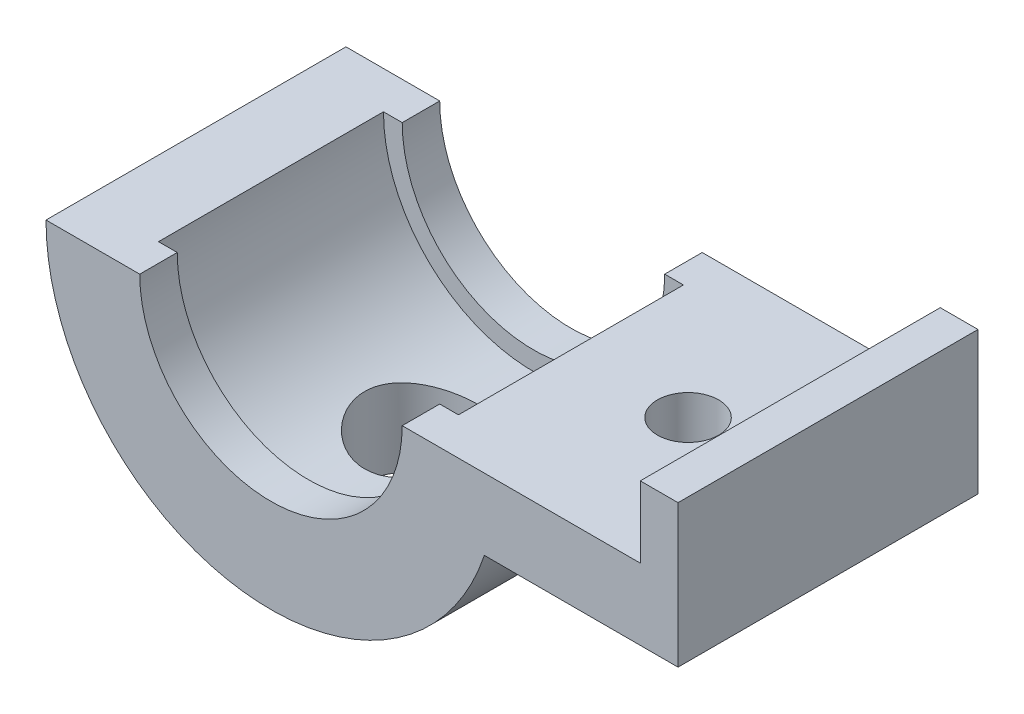
ISO-10303-21;
HEADER;
FILE_DESCRIPTION(('STEP AP214'),'2;1');
FILE_NAME('part.step','',(''),(''),'','','');
FILE_SCHEMA(('AUTOMOTIVE_DESIGN { 1 0 10303 214 1 1 1 1 }'));
ENDSEC;
DATA;
#1=APPLICATION_CONTEXT('core data for automotive mechanical design processes');
#2=APPLICATION_PROTOCOL_DEFINITION('international standard','automotive_design',2000,#1);
#3=PRODUCT_CONTEXT('',#1,'mechanical');
#4=PRODUCT('Part','Part','',(#3));
#5=PRODUCT_RELATED_PRODUCT_CATEGORY('part','',(#4));
#6=PRODUCT_DEFINITION_FORMATION('','',#4);
#7=PRODUCT_DEFINITION_CONTEXT('part definition',#1,'design');
#8=PRODUCT_DEFINITION('design','',#6,#7);
#9=PRODUCT_DEFINITION_SHAPE('','',#8);
#10=(LENGTH_UNIT() NAMED_UNIT(*) SI_UNIT(.MILLI.,.METRE.));
#11=(NAMED_UNIT(*) PLANE_ANGLE_UNIT() SI_UNIT($,.RADIAN.));
#12=(NAMED_UNIT(*) SI_UNIT($,.STERADIAN.) SOLID_ANGLE_UNIT());
#13=UNCERTAINTY_MEASURE_WITH_UNIT(LENGTH_MEASURE(1.E-05),#10,'distance_accuracy_value','');
#14=(GEOMETRIC_REPRESENTATION_CONTEXT(3) GLOBAL_UNCERTAINTY_ASSIGNED_CONTEXT((#13)) GLOBAL_UNIT_ASSIGNED_CONTEXT((#10,
#11,#12)) REPRESENTATION_CONTEXT('',''));
#15=CARTESIAN_POINT('',(0.,0.,0.));
#16=DIRECTION('',(0.,0.,1.));
#17=DIRECTION('',(1.,0.,0.));
#18=AXIS2_PLACEMENT_3D('',#15,#16,#17);
#19=CARTESIAN_POINT('',(35.,0.,-40.));
#20=DIRECTION('',(0.,1.,0.));
#21=DIRECTION('',(0.,0.,1.));
#22=AXIS2_PLACEMENT_3D('',#19,#20,#21);
#23=PLANE('',#22);
#24=CARTESIAN_POINT('',(71.2325551320015,0.,0.));
#25=DIRECTION('',(0.,1.,0.));
#26=DIRECTION('',(0.,0.,1.));
#27=AXIS2_PLACEMENT_3D('',#24,#25,#26);
#28=CIRCLE('',#27,8.1629970329379);
#29=CARTESIAN_POINT('',(71.2325551320015,0.,8.1629970329379));
#30=VERTEX_POINT('',#29);
#31=EDGE_CURVE('E163',#30,#30,#28,.T.);
#32=ORIENTED_EDGE('',*,*,#31,.F.);
#33=EDGE_LOOP('',(#32));
#34=FACE_BOUND('',#33,.T.);
#35=DIRECTION('',(-1.,0.,0.));
#36=VECTOR('',#35,1.);
#37=CARTESIAN_POINT('',(35.,0.,40.));
#38=LINE('',#37,#36);
#39=CARTESIAN_POINT('',(98.4889316436633,0.,40.));
#40=VERTEX_POINT('',#39);
#41=CARTESIAN_POINT('',(35.,0.,40.));
#42=VERTEX_POINT('',#41);
#43=EDGE_CURVE('E62',#40,#42,#38,.T.);
#44=ORIENTED_EDGE('',*,*,#43,.F.);
#45=DIRECTION('',(0.,0.,1.));
#46=VECTOR('',#45,1.);
#47=CARTESIAN_POINT('',(98.4889316436633,0.,-40.));
#48=LINE('',#47,#46);
#49=CARTESIAN_POINT('',(98.4889316436633,0.,-40.));
#50=VERTEX_POINT('',#49);
#51=EDGE_CURVE('E57',#50,#40,#48,.T.);
#52=ORIENTED_EDGE('',*,*,#51,.F.);
#53=DIRECTION('',(-1.,0.,0.));
#54=VECTOR('',#53,1.);
#55=CARTESIAN_POINT('',(35.,0.,-40.));
#56=LINE('',#55,#54);
#57=CARTESIAN_POINT('',(35.,0.,-40.));
#58=VERTEX_POINT('',#57);
#59=EDGE_CURVE('E401',#50,#58,#56,.T.);
#60=ORIENTED_EDGE('',*,*,#59,.T.);
#61=DIRECTION('',(0.,0.,1.));
#62=VECTOR('',#61,1.);
#63=CARTESIAN_POINT('',(35.,0.,-40.));
#64=LINE('',#63,#62);
#65=CARTESIAN_POINT('',(35.,0.,-30.));
#66=VERTEX_POINT('',#65);
#67=EDGE_CURVE('E406',#58,#66,#64,.T.);
#68=ORIENTED_EDGE('',*,*,#67,.T.);
#69=DIRECTION('',(1.,0.,0.));
#70=VECTOR('',#69,1.);
#71=CARTESIAN_POINT('',(35.,0.,-30.));
#72=LINE('',#71,#70);
#73=CARTESIAN_POINT('',(40.,0.,-30.));
#74=VERTEX_POINT('',#73);
#75=EDGE_CURVE('E424',#66,#74,#72,.T.);
#76=ORIENTED_EDGE('',*,*,#75,.T.);
#77=DIRECTION('',(0.,0.,-1.));
#78=VECTOR('',#77,1.);
#79=CARTESIAN_POINT('',(40.,0.,30.));
#80=LINE('',#79,#78);
#81=CARTESIAN_POINT('',(40.,0.,30.));
#82=VERTEX_POINT('',#81);
#83=EDGE_CURVE('E435',#74,#82,#80,.F.);
#84=ORIENTED_EDGE('',*,*,#83,.T.);
#85=DIRECTION('',(1.,0.,0.));
#86=VECTOR('',#85,1.);
#87=CARTESIAN_POINT('',(35.,0.,30.));
#88=LINE('',#87,#86);
#89=CARTESIAN_POINT('',(35.,0.,30.));
#90=VERTEX_POINT('',#89);
#91=EDGE_CURVE('E420',#90,#82,#88,.T.);
#92=ORIENTED_EDGE('',*,*,#91,.F.);
#93=EDGE_CURVE('E399',#90,#42,#64,.T.);
#94=ORIENTED_EDGE('',*,*,#93,.T.);
#95=EDGE_LOOP('',(#44,#52,#60,#68,#76,#84,#92,#94));
#96=FACE_BOUND('',#95,.T.);
#97=ADVANCED_FACE('F39',(#34,#96),#23,.T.);
#98=CARTESIAN_POINT('',(0.,0.,-40.));
#99=DIRECTION('',(0.,0.,1.));
#100=DIRECTION('',(1.,0.,0.));
#101=AXIS2_PLACEMENT_3D('',#98,#99,#100);
#102=CYLINDRICAL_SURFACE('',#101,60.);
#103=CARTESIAN_POINT('',(0.,-60.,15.));
#104=CARTESIAN_POINT('',(-0.414415031152329,-59.9999990212772,14.9999982513786));
#105=CARTESIAN_POINT('',(-0.828865177127538,-59.9956958137385,14.9828115256312));
#106=CARTESIAN_POINT('',(-1.65477222486746,-59.9785995385129,14.9142041325291));
#107=CARTESIAN_POINT('',(-2.06622877970378,-59.9658055021792,14.8627795592657));
#108=CARTESIAN_POINT('',(-2.88336026305808,-59.9320742475583,14.7260961940826));
#109=CARTESIAN_POINT('',(-3.28903215036171,-59.9111328985038,14.6408202387339));
#110=CARTESIAN_POINT('',(-4.09148350940317,-59.8616853391716,14.4371437304935));
#111=CARTESIAN_POINT('',(-4.48826320816741,-59.8331793222664,14.318744024327));
#112=CARTESIAN_POINT('',(-5.26971792546056,-59.7694201661329,14.0499324418028));
#113=CARTESIAN_POINT('',(-5.65440707152432,-59.7341752704624,13.8995596526577));
#114=CARTESIAN_POINT('',(-6.40960090891932,-59.6578668070925,13.5678703590465));
#115=CARTESIAN_POINT('',(-6.78010552512076,-59.6168032085792,13.3865536907107));
#116=CARTESIAN_POINT('',(-7.50450174776048,-59.5299550145894,12.99431049265));
#117=CARTESIAN_POINT('',(-7.85839359463823,-59.4841704874704,12.7833843916439));
#118=CARTESIAN_POINT('',(-8.54732477282215,-59.389091455063,12.3333909755978));
#119=CARTESIAN_POINT('',(-8.88236327250113,-59.3397967951584,12.0943224206211));
#120=CARTESIAN_POINT('',(-9.53747021532843,-59.2380669554889,11.584989053153));
#121=CARTESIAN_POINT('',(-9.85714762091099,-59.185590574916,11.3142294012828));
#122=CARTESIAN_POINT('',(-10.4726747741415,-59.0797818778322,10.7470108491145));
#123=CARTESIAN_POINT('',(-10.7685242401378,-59.0264495512127,10.4505516451279));
#124=CARTESIAN_POINT('',(-11.3344931170602,-58.9203885746364,9.83384195462124));
#125=CARTESIAN_POINT('',(-11.6046093369326,-58.8676600002593,9.51358852623765));
#126=CARTESIAN_POINT('',(-12.1172537986861,-58.7642795799148,8.85141104836226));
#127=CARTESIAN_POINT('',(-12.3597827535991,-58.7136276802944,8.50948755931975));
#128=CARTESIAN_POINT('',(-12.8189816118067,-58.6150978639965,7.80093437937954));
#129=CARTESIAN_POINT('',(-13.0352120253514,-58.5672725696924,7.43401232473522));
#130=CARTESIAN_POINT('',(-13.4359199038929,-58.4766472825933,6.68261526065164));
#131=CARTESIAN_POINT('',(-13.6203969680463,-58.433847353239,6.29814002970463));
#132=CARTESIAN_POINT('',(-13.9561270829236,-58.3545738248081,5.5143669552817));
#133=CARTESIAN_POINT('',(-14.1073842665445,-58.3180994388874,5.11507096289577));
#134=CARTESIAN_POINT('',(-14.3754523010491,-58.2526002290377,4.30448428479723));
#135=CARTESIAN_POINT('',(-14.4922639770391,-58.2235752266686,3.8931938866575));
#136=CARTESIAN_POINT('',(-14.6884504119626,-58.1743882934223,3.06999366538015));
#137=CARTESIAN_POINT('',(-14.7685281338398,-58.1540604879679,2.65826124189149));
#138=CARTESIAN_POINT('',(-14.8939506116738,-58.1220649835953,1.82920515599655));
#139=CARTESIAN_POINT('',(-14.9392957887028,-58.1103971796894,1.41188156143601));
#140=CARTESIAN_POINT('',(-14.9948497395526,-58.0960868540863,0.574807014125323));
#141=CARTESIAN_POINT('',(-15.0050635020682,-58.0934430509726,0.155056414492343));
#142=CARTESIAN_POINT('',(-14.9902770061642,-58.0972603112452,-0.683779210823856));
#143=CARTESIAN_POINT('',(-14.9652772373859,-58.1037212480307,-1.10286424568058));
#144=CARTESIAN_POINT('',(-14.8813213611209,-58.1252792391452,-1.92709534972119));
#145=CARTESIAN_POINT('',(-14.8232043401012,-58.1401628280118,-2.33233281893186));
#146=CARTESIAN_POINT('',(-14.6741460581697,-58.1779626704993,-3.1363342473404));
#147=CARTESIAN_POINT('',(-14.5832054078995,-58.2008787746853,-3.53509832682316));
#148=CARTESIAN_POINT('',(-14.3692298841906,-58.2540759960574,-4.32343147577072));
#149=CARTESIAN_POINT('',(-14.246193444193,-58.284357472734,-4.71300009540322));
#150=CARTESIAN_POINT('',(-13.968984149895,-58.3514164276321,-5.48031895848233));
#151=CARTESIAN_POINT('',(-13.814810805212,-58.3881940081611,-5.85806901568728));
#152=CARTESIAN_POINT('',(-13.4747678044654,-58.4676098785467,-6.60302709105003));
#153=CARTESIAN_POINT('',(-13.2885944462794,-58.5103034839325,-6.9700905472671));
#154=CARTESIAN_POINT('',(-12.8869942084194,-58.6000656495573,-7.68728161079928));
#155=CARTESIAN_POINT('',(-12.6715672207223,-58.6471342259512,-8.0374091555697));
#156=CARTESIAN_POINT('',(-12.2129089816034,-58.7443596923192,-8.71857019928794));
#157=CARTESIAN_POINT('',(-11.9696736689771,-58.7945170328901,-9.04960089863109));
#158=CARTESIAN_POINT('',(-11.457029276384,-58.8965598978932,-9.69045217253495));
#159=CARTESIAN_POINT('',(-11.187619690236,-58.9484454557344,-10.0002723367101));
#160=CARTESIAN_POINT('',(-10.6163053259096,-59.05404993838,-10.6052849357017));
#161=CARTESIAN_POINT('',(-10.3136925474027,-59.1077789230623,-10.8998074798551));
#162=CARTESIAN_POINT('',(-9.68460506109727,-59.2141044830185,-11.4623948437548));
#163=CARTESIAN_POINT('',(-9.35812988726896,-59.26670103615,-11.7304591465342));
#164=CARTESIAN_POINT('',(-8.68345927450772,-59.3693013435736,-12.238292604832));
#165=CARTESIAN_POINT('',(-8.33526298615102,-59.4193049963276,-12.4780606527381));
#166=CARTESIAN_POINT('',(-7.6194773312438,-59.5153252061723,-12.9275737893408));
#167=CARTESIAN_POINT('',(-7.25188808297449,-59.5613417875761,-13.1373190611228));
#168=CARTESIAN_POINT('',(-6.49849482068106,-59.6482508279205,-13.5258947757965));
#169=CARTESIAN_POINT('',(-6.11263206168022,-59.6891249639438,-13.7046154892899));
#170=CARTESIAN_POINT('',(-5.32657430647362,-59.764399712673,-14.0288400773493));
#171=CARTESIAN_POINT('',(-4.92637922976253,-59.7988002890097,-14.1743437652996));
#172=CARTESIAN_POINT('',(-4.11460263537916,-59.8601343840093,-14.4309118169275));
#173=CARTESIAN_POINT('',(-3.70302290075579,-59.8870690647689,-14.5419815407098));
#174=CARTESIAN_POINT('',(-2.87146870312269,-59.9326958329816,-14.7287557262455));
#175=CARTESIAN_POINT('',(-2.45149444734257,-59.9513881236467,-14.8044610598931));
#176=CARTESIAN_POINT('',(-1.61715710849188,-59.9796178381032,-14.9183617088027));
#177=CARTESIAN_POINT('',(-1.20292567409389,-59.989377407444,-14.9574677940361));
#178=CARTESIAN_POINT('',(-0.372535473351761,-60.0002801559201,-15.0011356809785));
#179=CARTESIAN_POINT('',(0.0436232599910904,-60.0014234820501,-15.0056980720094));
#180=CARTESIAN_POINT('',(0.874778652969329,-59.9950620411867,-14.9802409315793));
#181=CARTESIAN_POINT('',(1.28977540609494,-59.9875579912256,-14.9502242673816));
#182=CARTESIAN_POINT('',(2.115605360557,-59.9641130343762,-14.8558721196687));
#183=CARTESIAN_POINT('',(2.52643857816607,-59.9481721604751,-14.7915367703362));
#184=CARTESIAN_POINT('',(3.33491700211606,-59.9085946352651,-14.6303011829582));
#185=CARTESIAN_POINT('',(3.73266745700123,-59.8850758192925,-14.5338988800892));
#186=CARTESIAN_POINT('',(4.51851147499013,-59.8309132808785,-14.3090906707923));
#187=CARTESIAN_POINT('',(4.90660516270469,-59.8002696504284,-14.1806851775692));
#188=CARTESIAN_POINT('',(5.67056994821774,-59.7326687672958,-13.8928498096287));
#189=CARTESIAN_POINT('',(6.04644014282222,-59.6957110493213,-13.733417648402));
#190=CARTESIAN_POINT('',(6.78348695008258,-59.6164550142952,-13.3847122795827));
#191=CARTESIAN_POINT('',(7.14466329131014,-59.5741565986481,-13.1954385210636));
#192=CARTESIAN_POINT('',(7.85628879766163,-59.4845326121402,-12.7847748833131));
#193=CARTESIAN_POINT('',(8.20643404326051,-59.4371311779976,-12.5628748791056));
#194=CARTESIAN_POINT('',(8.88687850660034,-59.3392076529078,-12.0911038276452));
#195=CARTESIAN_POINT('',(9.21717753166791,-59.2886855316736,-11.8412325089053));
#196=CARTESIAN_POINT('',(9.8558812728268,-59.1858620637829,-11.3151581391403));
#197=CARTESIAN_POINT('',(10.1642826522026,-59.1335604477592,-11.038951090093));
#198=CARTESIAN_POINT('',(10.7571797495061,-59.0285841290434,-10.4620351890063));
#199=CARTESIAN_POINT('',(11.0416751968834,-58.9759094221362,-10.1613260597457));
#200=CARTESIAN_POINT('',(11.5916120324103,-58.8703224072042,-9.52964680036491));
#201=CARTESIAN_POINT('',(11.856413160808,-58.8174360855768,-9.19811452423791));
#202=CARTESIAN_POINT('',(12.3571634560666,-58.7142732843699,-8.5135400404505));
#203=CARTESIAN_POINT('',(12.5931120964092,-58.6639968524269,-8.1604974404322));
#204=CARTESIAN_POINT('',(13.0344485947135,-58.5675182509941,-7.43527548124412));
#205=CARTESIAN_POINT('',(13.2398371684664,-58.5213159860877,-7.06309657056827));
#206=CARTESIAN_POINT('',(13.6185056268275,-58.4343569087878,-6.30213527518355));
#207=CARTESIAN_POINT('',(13.7917859581176,-58.3936000206418,-5.91335312154752));
#208=CARTESIAN_POINT('',(14.1039245928626,-58.3189928454895,-5.12427975033881));
#209=CARTESIAN_POINT('',(14.2429831869188,-58.2851025868138,-4.72407158157005));
#210=CARTESIAN_POINT('',(14.486872684975,-58.2249629937438,-3.91279020846945));
#211=CARTESIAN_POINT('',(14.5917036369446,-58.1987136486409,-3.50171701936568));
#212=CARTESIAN_POINT('',(14.7662190899979,-58.1546806858336,-2.67180492240674));
#213=CARTESIAN_POINT('',(14.8359100402463,-58.1368955147523,-2.25296745415154));
#214=CARTESIAN_POINT('',(14.9395526451384,-58.1103488477808,-1.41061301743722));
#215=CARTESIAN_POINT('',(14.9735051596328,-58.1015871347904,-0.987096161809816));
#216=CARTESIAN_POINT('',(15.0049083306892,-58.0934847297816,-0.15082867616439));
#217=CARTESIAN_POINT('',(15.0033804310492,-58.0938804050574,0.261881388519998));
#218=CARTESIAN_POINT('',(14.9663395836518,-58.1034340314097,1.08566536046238));
#219=CARTESIAN_POINT('',(14.9308273235709,-58.1125918051844,1.49673930065848));
#220=CARTESIAN_POINT('',(14.8261237251337,-58.1393925403981,2.31427949814698));
#221=CARTESIAN_POINT('',(14.7569332823055,-58.1570352762153,2.72074587766381));
#222=CARTESIAN_POINT('',(14.5854532644127,-58.200277995233,3.52620151630435));
#223=CARTESIAN_POINT('',(14.4831635234226,-58.2258780183229,3.92519073793478));
#224=CARTESIAN_POINT('',(14.2470250698785,-58.2841055202704,4.71056454910861));
#225=CARTESIAN_POINT('',(14.1133689913662,-58.3166900027724,5.0970103068742));
#226=CARTESIAN_POINT('',(13.8152021764003,-58.3880438880629,5.857208630456));
#227=CARTESIAN_POINT('',(13.6506916610057,-58.4268132465389,6.2309612871903));
#228=CARTESIAN_POINT('',(13.2920021544663,-58.5094567895869,6.96340303885025));
#229=CARTESIAN_POINT('',(13.0978200005075,-58.5533315182408,7.32209052271876));
#230=CARTESIAN_POINT('',(12.6811544509806,-58.6449810815152,8.02210956167509));
#231=CARTESIAN_POINT('',(12.458670452026,-58.6927559992788,8.36344074651485));
#232=CARTESIAN_POINT('',(11.9807255554322,-58.7922045754333,9.03529585402747));
#233=CARTESIAN_POINT('',(11.7245556260798,-58.8439474391643,9.3653053323191));
#234=CARTESIAN_POINT('',(11.185709798109,-58.9487507139632,10.0027027788286));
#235=CARTESIAN_POINT('',(10.9030334264329,-59.0018111485332,10.3100903431408));
#236=CARTESIAN_POINT('',(10.3129641159302,-59.1078050911363,10.9003186177996));
#237=CARTESIAN_POINT('',(10.0055655042192,-59.1607385671509,11.183153663069));
#238=CARTESIAN_POINT('',(9.36809923917265,-59.2650234713998,11.7223285281152));
#239=CARTESIAN_POINT('',(9.03803160357736,-59.3163749008722,11.9786683686262));
#240=CARTESIAN_POINT('',(8.35117725650719,-59.4170047912239,12.4675066358601));
#241=CARTESIAN_POINT('',(7.9940145122165,-59.4662287612614,12.6994883165733));
#242=CARTESIAN_POINT('',(7.2607958151773,-59.5602000765112,13.1324833827577));
#243=CARTESIAN_POINT('',(6.88473897414382,-59.6049472109536,13.3334953104103));
#244=CARTESIAN_POINT('',(6.11659979378916,-59.6886619653552,13.7028726095973));
#245=CARTESIAN_POINT('',(5.72452786496643,-59.7276332659261,13.8712587928809));
#246=CARTESIAN_POINT('',(4.92694703887668,-59.7987072720503,14.1741701107562));
#247=CARTESIAN_POINT('',(4.52144017906876,-59.8308110136387,14.3087003533725));
#248=CARTESIAN_POINT('',(3.7774977057089,-59.8819018425693,14.5206961040711));
#249=CARTESIAN_POINT('',(3.44084239200543,-59.9022208731405,14.6041392318802));
#250=CARTESIAN_POINT('',(2.762183405006,-59.9373488480094,14.7475638014757));
#251=CARTESIAN_POINT('',(2.42017843655638,-59.952156435777,14.8075394674075));
#252=CARTESIAN_POINT('',(1.73265286448917,-59.9759636703454,14.9036367493883));
#253=CARTESIAN_POINT('',(1.3871324725956,-59.9849636648424,14.9397597934786));
#254=CARTESIAN_POINT('',(0.694415963999577,-59.9969814606603,14.9879390172495));
#255=CARTESIAN_POINT('',(0.347220307362893,-60.0000008200292,15.0000014650937));
#256=CARTESIAN_POINT('',(0.,-60.,15.));
#257=B_SPLINE_CURVE_WITH_KNOTS('',3,(#103,#104,#105,#106,#107,#108,#109,#110,#111,#112,#113,
#114,#115,#116,#117,#118,#119,#120,#121,#122,#123,#124,#125,#126,#127,#128,#129,#130,#131,#132,
#133,#134,#135,#136,#137,#138,#139,#140,#141,#142,#143,#144,#145,#146,#147,#148,#149,#150,#151,
#152,#153,#154,#155,#156,#157,#158,#159,#160,#161,#162,#163,#164,#165,#166,#167,#168,#169,#170,
#171,#172,#173,#174,#175,#176,#177,#178,#179,#180,#181,#182,#183,#184,#185,#186,#187,#188,#189,
#190,#191,#192,#193,#194,#195,#196,#197,#198,#199,#200,#201,#202,#203,#204,#205,#206,#207,#208,
#209,#210,#211,#212,#213,#214,#215,#216,#217,#218,#219,#220,#221,#222,#223,#224,#225,#226,#227,
#228,#229,#230,#231,#232,#233,#234,#235,#236,#237,#238,#239,#240,#241,#242,#243,#244,#245,#246,
#247,#248,#249,#250,#251,#252,#253,#254,#255,#256),.UNSPECIFIED.,.T.,.F.,(4,2,2,2,2,2,2,2,2,2,2,
2,2,2,2,2,2,2,2,2,2,2,2,2,2,2,2,2,2,2,2,2,2,2,2,2,2,2,2,2,2,2,2,2,2,2,2,2,2,2,2,2,2,2,2,2,2,2,2,
2,2,2,2,2,2,2,2,2,2,2,2,2,2,2,2,2,4),(0.,1.24292863401903,2.48599908764076,3.7297006132274,
4.97337034962156,6.21552834803257,7.4576929247504,8.69983951786054,9.94204085957448,
11.2071968009062,12.4723676944775,13.7376952720294,15.0029901379623,16.2871511292081,
17.571328330072,18.8553456753848,20.1393322609003,21.3976019103658,22.6558563052369,
23.9139320193924,25.171990240284,26.399506787422,27.6270004993685,28.854554135098,
30.0821271053774,31.322068356256,32.5620141859154,33.802141332563,35.0422924666542,
36.317839699943,37.5934118511794,38.8690339161232,40.1446482017138,41.4246860875104,
42.7047311644711,43.9845768852246,45.2643910502589,46.5114371116395,47.7584618981265,
49.0053832899097,50.2522998063844,51.4806938551532,52.709072044508,53.9375407934567,
55.1660322246747,56.4163147184903,57.666609348484,58.9170940885931,60.1675929788926,
61.4488300985864,62.7300905956168,64.011321077674,65.2925337342294,66.5660592524554,
67.8395829858429,69.112872907166,70.3861321930042,71.6227823534782,72.8594074907594,
74.0959997470435,75.3325982024077,76.5617922379894,77.7909774672469,79.0202938116032,
80.2496363689899,81.511058609136,82.7725033660362,84.0342384105595,85.2959724676882,
86.5805910180235,87.8652700198901,89.1491268157816,90.4327897931259,91.4742631787727,
92.5159927327571,93.5576599134007,94.5990556879077),.UNSPECIFIED.);
#258=CARTESIAN_POINT('',(0.,-60.,15.));
#259=VERTEX_POINT('',#258);
#260=EDGE_CURVE('E188',#259,#259,#257,.T.);
#261=ORIENTED_EDGE('',*,*,#260,.F.);
#262=EDGE_LOOP('',(#261));
#263=FACE_BOUND('',#262,.T.);
#264=CARTESIAN_POINT('',(0.,0.,-40.));
#265=DIRECTION('',(0.,0.,1.));
#266=DIRECTION('',(1.,0.,0.));
#267=AXIS2_PLACEMENT_3D('',#264,#265,#266);
#268=CIRCLE('',#267,60.);
#269=CARTESIAN_POINT('',(-60.,0.,-40.));
#270=VERTEX_POINT('',#269);
#271=CARTESIAN_POINT('',(56.9122131005288,-19.,-40.));
#272=VERTEX_POINT('',#271);
#273=EDGE_CURVE('E457',#270,#272,#268,.T.);
#274=ORIENTED_EDGE('',*,*,#273,.T.);
#275=DIRECTION('',(0.,0.,1.));
#276=VECTOR('',#275,1.);
#277=CARTESIAN_POINT('',(56.9122131005288,-19.,-40.));
#278=LINE('',#277,#276);
#279=CARTESIAN_POINT('',(56.9122131005288,-19.,40.));
#280=VERTEX_POINT('',#279);
#281=EDGE_CURVE('E183',#272,#280,#278,.T.);
#282=ORIENTED_EDGE('',*,*,#281,.T.);
#283=CARTESIAN_POINT('',(0.,0.,40.));
#284=DIRECTION('',(0.,0.,1.));
#285=DIRECTION('',(1.,0.,0.));
#286=AXIS2_PLACEMENT_3D('',#283,#284,#285);
#287=CIRCLE('',#286,60.);
#288=CARTESIAN_POINT('',(-60.,0.,40.));
#289=VERTEX_POINT('',#288);
#290=EDGE_CURVE('E446',#289,#280,#287,.T.);
#291=ORIENTED_EDGE('',*,*,#290,.F.);
#292=DIRECTION('',(0.,0.,1.));
#293=VECTOR('',#292,1.);
#294=CARTESIAN_POINT('',(-60.,0.,-40.));
#295=LINE('',#294,#293);
#296=EDGE_CURVE('E394',#270,#289,#295,.T.);
#297=ORIENTED_EDGE('',*,*,#296,.F.);
#298=EDGE_LOOP('',(#274,#282,#291,#297));
#299=FACE_BOUND('',#298,.T.);
#300=ADVANCED_FACE('F199',(#263,#299),#102,.T.);
#301=CARTESIAN_POINT('',(0.,0.,-40.));
#302=DIRECTION('',(0.,0.,1.));
#303=DIRECTION('',(1.,0.,0.));
#304=AXIS2_PLACEMENT_3D('',#301,#302,#303);
#305=CYLINDRICAL_SURFACE('',#304,35.);
#306=DIRECTION('',(0.,0.,1.));
#307=VECTOR('',#306,1.);
#308=CARTESIAN_POINT('',(-35.,0.,-40.));
#309=LINE('',#308,#307);
#310=CARTESIAN_POINT('',(-35.,0.,-40.));
#311=VERTEX_POINT('',#310);
#312=CARTESIAN_POINT('',(-35.,0.,-30.));
#313=VERTEX_POINT('',#312);
#314=EDGE_CURVE('E385',#311,#313,#309,.T.);
#315=ORIENTED_EDGE('',*,*,#314,.T.);
#316=CARTESIAN_POINT('',(0.,0.,-30.));
#317=DIRECTION('',(0.,0.,1.));
#318=DIRECTION('',(1.,0.,0.));
#319=AXIS2_PLACEMENT_3D('',#316,#317,#318);
#320=CIRCLE('',#319,35.);
#321=EDGE_CURVE('E387',#313,#66,#320,.T.);
#322=ORIENTED_EDGE('',*,*,#321,.T.);
#323=ORIENTED_EDGE('',*,*,#67,.F.);
#324=CARTESIAN_POINT('',(0.,0.,-40.));
#325=DIRECTION('',(0.,0.,-1.));
#326=DIRECTION('',(1.,0.,0.));
#327=AXIS2_PLACEMENT_3D('',#324,#325,#326);
#328=CIRCLE('',#327,35.);
#329=EDGE_CURVE('E389',#58,#311,#328,.T.);
#330=ORIENTED_EDGE('',*,*,#329,.T.);
#331=EDGE_LOOP('',(#315,#322,#323,#330));
#332=FACE_BOUND('',#331,.T.);
#333=ADVANCED_FACE('F236',(#332),#305,.F.);
#334=CARTESIAN_POINT('',(0.,0.,30.));
#335=DIRECTION('',(0.,0.,1.));
#336=DIRECTION('',(1.,0.,0.));
#337=AXIS2_PLACEMENT_3D('',#334,#335,#336);
#338=CIRCLE('',#337,35.);
#339=CARTESIAN_POINT('',(-35.,0.,30.));
#340=VERTEX_POINT('',#339);
#341=EDGE_CURVE('E430',#340,#90,#338,.T.);
#342=ORIENTED_EDGE('',*,*,#341,.F.);
#343=CARTESIAN_POINT('',(-35.,0.,40.));
#344=VERTEX_POINT('',#343);
#345=EDGE_CURVE('E395',#340,#344,#309,.T.);
#346=ORIENTED_EDGE('',*,*,#345,.T.);
#347=CARTESIAN_POINT('',(0.,0.,40.));
#348=DIRECTION('',(0.,0.,-1.));
#349=DIRECTION('',(1.,0.,0.));
#350=AXIS2_PLACEMENT_3D('',#347,#348,#349);
#351=CIRCLE('',#350,35.);
#352=EDGE_CURVE('E438',#42,#344,#351,.T.);
#353=ORIENTED_EDGE('',*,*,#352,.F.);
#354=ORIENTED_EDGE('',*,*,#93,.F.);
#355=EDGE_LOOP('',(#342,#346,#353,#354));
#356=FACE_BOUND('',#355,.T.);
#357=ADVANCED_FACE('F41',(#356),#305,.F.);
#358=CARTESIAN_POINT('',(-60.,0.,-40.));
#359=DIRECTION('',(0.,1.,0.));
#360=DIRECTION('',(0.,0.,1.));
#361=AXIS2_PLACEMENT_3D('',#358,#359,#360);
#362=PLANE('',#361);
#363=DIRECTION('',(1.,0.,0.));
#364=VECTOR('',#363,1.);
#365=CARTESIAN_POINT('',(-60.,0.,30.));
#366=LINE('',#365,#364);
#367=CARTESIAN_POINT('',(-40.,0.,30.));
#368=VERTEX_POINT('',#367);
#369=EDGE_CURVE('E11',#368,#340,#366,.T.);
#370=ORIENTED_EDGE('',*,*,#369,.F.);
#371=DIRECTION('',(0.,0.,-1.));
#372=VECTOR('',#371,1.);
#373=CARTESIAN_POINT('',(-40.,0.,30.));
#374=LINE('',#373,#372);
#375=CARTESIAN_POINT('',(-40.,0.,-30.));
#376=VERTEX_POINT('',#375);
#377=EDGE_CURVE('E49',#368,#376,#374,.T.);
#378=ORIENTED_EDGE('',*,*,#377,.T.);
#379=DIRECTION('',(1.,0.,0.));
#380=VECTOR('',#379,1.);
#381=CARTESIAN_POINT('',(-60.,0.,-30.));
#382=LINE('',#381,#380);
#383=EDGE_CURVE('E404',#376,#313,#382,.T.);
#384=ORIENTED_EDGE('',*,*,#383,.T.);
#385=ORIENTED_EDGE('',*,*,#314,.F.);
#386=DIRECTION('',(-1.,0.,0.));
#387=VECTOR('',#386,1.);
#388=CARTESIAN_POINT('',(-60.,0.,-40.));
#389=LINE('',#388,#387);
#390=EDGE_CURVE('E454',#311,#270,#389,.T.);
#391=ORIENTED_EDGE('',*,*,#390,.T.);
#392=ORIENTED_EDGE('',*,*,#296,.T.);
#393=DIRECTION('',(-1.,0.,0.));
#394=VECTOR('',#393,1.);
#395=CARTESIAN_POINT('',(-60.,0.,40.));
#396=LINE('',#395,#394);
#397=EDGE_CURVE('E442',#344,#289,#396,.T.);
#398=ORIENTED_EDGE('',*,*,#397,.F.);
#399=ORIENTED_EDGE('',*,*,#345,.F.);
#400=EDGE_LOOP('',(#370,#378,#384,#385,#391,#392,#398,#399));
#401=FACE_BOUND('',#400,.T.);
#402=ADVANCED_FACE('F230',(#401),#362,.T.);
#403=CARTESIAN_POINT('',(0.,0.,-40.));
#404=DIRECTION('',(0.,0.,1.));
#405=DIRECTION('',(1.,0.,0.));
#406=AXIS2_PLACEMENT_3D('',#403,#404,#405);
#407=PLANE('',#406);
#408=ORIENTED_EDGE('',*,*,#329,.F.);
#409=ORIENTED_EDGE('',*,*,#59,.F.);
#410=DIRECTION('',(0.,-1.,0.));
#411=VECTOR('',#410,1.);
#412=CARTESIAN_POINT('',(98.4889316436633,19.,-40.));
#413=LINE('',#412,#411);
#414=CARTESIAN_POINT('',(98.4889316436633,19.,-40.));
#415=VERTEX_POINT('',#414);
#416=EDGE_CURVE('E148',#415,#50,#413,.T.);
#417=ORIENTED_EDGE('',*,*,#416,.F.);
#418=DIRECTION('',(-1.,0.,0.));
#419=VECTOR('',#418,1.);
#420=CARTESIAN_POINT('',(108.557995435877,19.,-40.));
#421=LINE('',#420,#419);
#422=CARTESIAN_POINT('',(108.557995435877,19.,-40.));
#423=VERTEX_POINT('',#422);
#424=EDGE_CURVE('E144',#423,#415,#421,.T.);
#425=ORIENTED_EDGE('',*,*,#424,.F.);
#426=DIRECTION('',(0.,1.,0.));
#427=VECTOR('',#426,1.);
#428=CARTESIAN_POINT('',(108.557995435877,-19.,-40.));
#429=LINE('',#428,#427);
#430=CARTESIAN_POINT('',(108.557995435877,-19.,-40.));
#431=VERTEX_POINT('',#430);
#432=EDGE_CURVE('E128',#431,#423,#429,.T.);
#433=ORIENTED_EDGE('',*,*,#432,.F.);
#434=DIRECTION('',(-1.,0.,0.));
#435=VECTOR('',#434,1.);
#436=CARTESIAN_POINT('',(40.6140506308165,-19.,-40.));
#437=LINE('',#436,#435);
#438=EDGE_CURVE('E177',#431,#272,#437,.T.);
#439=ORIENTED_EDGE('',*,*,#438,.T.);
#440=ORIENTED_EDGE('',*,*,#273,.F.);
#441=ORIENTED_EDGE('',*,*,#390,.F.);
#442=EDGE_LOOP('',(#408,#409,#417,#425,#433,#439,#440,#441));
#443=FACE_BOUND('',#442,.T.);
#444=ADVANCED_FACE('F146',(#443),#407,.F.);
#445=CARTESIAN_POINT('',(0.,0.,40.));
#446=DIRECTION('',(0.,0.,1.));
#447=DIRECTION('',(1.,0.,0.));
#448=AXIS2_PLACEMENT_3D('',#445,#446,#447);
#449=PLANE('',#448);
#450=DIRECTION('',(0.,1.,0.));
#451=VECTOR('',#450,1.);
#452=CARTESIAN_POINT('',(108.557995435877,-19.,40.));
#453=LINE('',#452,#451);
#454=CARTESIAN_POINT('',(108.557995435877,-19.,40.));
#455=VERTEX_POINT('',#454);
#456=CARTESIAN_POINT('',(108.557995435877,19.,40.));
#457=VERTEX_POINT('',#456);
#458=EDGE_CURVE('E140',#455,#457,#453,.T.);
#459=ORIENTED_EDGE('',*,*,#458,.T.);
#460=DIRECTION('',(1.,0.,0.));
#461=VECTOR('',#460,1.);
#462=CARTESIAN_POINT('',(108.557995435877,19.,40.));
#463=LINE('',#462,#461);
#464=CARTESIAN_POINT('',(98.4889316436633,19.,40.));
#465=VERTEX_POINT('',#464);
#466=EDGE_CURVE('E157',#465,#457,#463,.T.);
#467=ORIENTED_EDGE('',*,*,#466,.F.);
#468=DIRECTION('',(0.,-1.,0.));
#469=VECTOR('',#468,1.);
#470=CARTESIAN_POINT('',(98.4889316436633,19.,40.));
#471=LINE('',#470,#469);
#472=EDGE_CURVE('E168',#465,#40,#471,.T.);
#473=ORIENTED_EDGE('',*,*,#472,.T.);
#474=ORIENTED_EDGE('',*,*,#43,.T.);
#475=ORIENTED_EDGE('',*,*,#352,.T.);
#476=ORIENTED_EDGE('',*,*,#397,.T.);
#477=ORIENTED_EDGE('',*,*,#290,.T.);
#478=DIRECTION('',(1.,0.,0.));
#479=VECTOR('',#478,1.);
#480=CARTESIAN_POINT('',(40.6140506308165,-19.,40.));
#481=LINE('',#480,#479);
#482=EDGE_CURVE('E141',#280,#455,#481,.T.);
#483=ORIENTED_EDGE('',*,*,#482,.T.);
#484=EDGE_LOOP('',(#459,#467,#473,#474,#475,#476,#477,#483));
#485=FACE_BOUND('',#484,.T.);
#486=ADVANCED_FACE('F224',(#485),#449,.T.);
#487=CARTESIAN_POINT('',(0.,0.,30.));
#488=DIRECTION('',(0.,0.,-1.));
#489=DIRECTION('',(-1.,0.,0.));
#490=AXIS2_PLACEMENT_3D('',#487,#488,#489);
#491=CYLINDRICAL_SURFACE('',#490,40.);
#492=CARTESIAN_POINT('',(0.,-40.,15.));
#493=CARTESIAN_POINT('',(0.406155231941303,-40.0000013887431,15.0000018921891));
#494=CARTESIAN_POINT('',(0.812284348147753,-39.9938006269279,14.9834912647568));
#495=CARTESIAN_POINT('',(1.62147139095104,-39.9691710100067,14.9176263231748));
#496=CARTESIAN_POINT('',(2.02452957514366,-39.9507431922111,14.8682747951571));
#497=CARTESIAN_POINT('',(2.82456330894158,-39.9021609392328,14.737236485769));
#498=CARTESIAN_POINT('',(3.22153975126587,-39.8720082425855,14.6555544982452));
#499=CARTESIAN_POINT('',(4.00666931290046,-39.8007787911681,14.4606436348404));
#500=CARTESIAN_POINT('',(4.39482219784621,-39.759701746601,14.3474139220694));
#501=CARTESIAN_POINT('',(5.15891467482713,-39.6677879044666,14.0906962888775));
#502=CARTESIAN_POINT('',(5.53487700582704,-39.6169706650972,13.9472689490546));
#503=CARTESIAN_POINT('',(6.27301569946846,-39.5068163389401,13.6312311889178));
#504=CARTESIAN_POINT('',(6.63519216809261,-39.4474793176674,13.4586209930108));
#505=CARTESIAN_POINT('',(7.34362780959022,-39.3217570131001,13.085542057312));
#506=CARTESIAN_POINT('',(7.6898863174579,-39.2553714357202,12.8850721550282));
#507=CARTESIAN_POINT('',(8.36464792699763,-39.1171488135837,12.4576177223872));
#508=CARTESIAN_POINT('',(8.69314455467263,-39.0453098037457,12.230623618299));
#509=CARTESIAN_POINT('',(9.34264058613321,-38.8951200775699,11.7425006030479));
#510=CARTESIAN_POINT('',(9.66287704281832,-38.816625532978,11.4804004277814));
#511=CARTESIAN_POINT('',(10.2803557268531,-38.6576764432075,10.930924091206));
#512=CARTESIAN_POINT('',(10.5775973290844,-38.5772218448226,10.6435472432009));
#513=CARTESIAN_POINT('',(11.1475099377515,-38.4164124006621,10.0450900797516));
#514=CARTESIAN_POINT('',(11.4201695058726,-38.3360576183078,9.73399885270727));
#515=CARTESIAN_POINT('',(11.9390379498077,-38.1776498271183,9.09011937523098));
#516=CARTESIAN_POINT('',(12.1852557331364,-38.0995960496066,8.75733849254076));
#517=CARTESIAN_POINT('',(12.6586805831567,-37.9449890154007,8.05869788128968));
#518=CARTESIAN_POINT('',(12.8847959801516,-37.8686081960778,7.69205890956763));
#519=CARTESIAN_POINT('',(13.3051847550507,-37.7229581925958,6.93958177388026));
#520=CARTESIAN_POINT('',(13.4994571189537,-37.6536892349313,6.55374299903113));
#521=CARTESIAN_POINT('',(13.8544333470209,-37.5245301930475,5.76553767808262));
#522=CARTESIAN_POINT('',(14.015147681946,-37.4646371848129,5.36317633437897));
#523=CARTESIAN_POINT('',(14.3015331739474,-37.3562528480706,4.54467839352252));
#524=CARTESIAN_POINT('',(14.4272063865916,-37.3077608507878,4.12854260600324));
#525=CARTESIAN_POINT('',(14.6377728200119,-37.2256343859454,3.30296471878725));
#526=CARTESIAN_POINT('',(14.7241266556605,-37.1914723133209,2.8939476048363));
#527=CARTESIAN_POINT('',(14.8624687487976,-37.1364051781319,2.06925422201619));
#528=CARTESIAN_POINT('',(14.914457888768,-37.1154997751382,1.6535781244298));
#529=CARTESIAN_POINT('',(14.9834733208266,-37.0876922679378,0.819013513193047));
#530=CARTESIAN_POINT('',(15.00051204451,-37.0807851846467,0.400126194981082));
#531=CARTESIAN_POINT('',(14.9994645645736,-37.0812091486228,-0.437588920160318));
#532=CARTESIAN_POINT('',(14.9813797233542,-37.0885396436317,-0.856416718768245));
#533=CARTESIAN_POINT('',(14.9124348098487,-37.1163110276097,-1.66558214103884));
#534=CARTESIAN_POINT('',(14.8636042471798,-37.1359397477468,-2.05612270785485));
#535=CARTESIAN_POINT('',(14.7355873547809,-37.1869225256988,-2.83139777918228));
#536=CARTESIAN_POINT('',(14.656402420588,-37.2182760444665,-3.21613254976913));
#537=CARTESIAN_POINT('',(14.4684135891209,-37.291757457046,-3.97727362567279));
#538=CARTESIAN_POINT('',(14.3596065605833,-37.3338864898767,-4.35367904596791));
#539=CARTESIAN_POINT('',(14.1133273980098,-37.4276813895696,-5.09576706427993));
#540=CARTESIAN_POINT('',(13.9758543280917,-37.479347567792,-5.46144931176449));
#541=CARTESIAN_POINT('',(13.6705139760041,-37.5918075323209,-6.18665666356201));
#542=CARTESIAN_POINT('',(13.5021267029571,-37.6527538500109,-6.54593899565531));
#543=CARTESIAN_POINT('',(13.1379428423647,-37.7813677039867,-7.24923025485661));
#544=CARTESIAN_POINT('',(12.9421362090161,-37.8490377010179,-7.59323352295795));
#545=CARTESIAN_POINT('',(12.5244597645839,-37.9892935671165,-8.26402000720255));
#546=CARTESIAN_POINT('',(12.3025873820878,-38.0618799208879,-8.5908015197881));
#547=CARTESIAN_POINT('',(11.834148656599,-38.2101200096741,-9.22542629083877));
#548=CARTESIAN_POINT('',(11.5875811971466,-38.2857738832788,-9.53326869205388));
#549=CARTESIAN_POINT('',(11.0537012467449,-38.44344256231,-10.1485258104847));
#550=CARTESIAN_POINT('',(10.7647618949301,-38.5255420356548,-10.4545090845912));
#551=CARTESIAN_POINT('',(10.1622074990615,-38.688847504194,-11.0411172613779));
#552=CARTESIAN_POINT('',(9.84860247827213,-38.7700538471902,-11.3217523660818));
#553=CARTESIAN_POINT('',(9.19826252614065,-38.9294759681023,-11.8561883007412));
#554=CARTESIAN_POINT('',(8.86151413829134,-39.007689964296,-12.1099732974254));
#555=CARTESIAN_POINT('',(8.16719019647369,-39.1589476038946,-12.5886750200747));
#556=CARTESIAN_POINT('',(7.80962316257225,-39.231993335683,-12.8136034365821));
#557=CARTESIAN_POINT('',(7.06994033251437,-39.372069051516,-13.2363223599273));
#558=CARTESIAN_POINT('',(6.68752662946515,-39.4389861908746,-13.433629744047));
#559=CARTESIAN_POINT('',(5.90588698531559,-39.5635829668856,-13.7951405830679));
#560=CARTESIAN_POINT('',(5.50666073576374,-39.6212624339658,-13.9593434302963));
#561=CARTESIAN_POINT('',(4.69439988189091,-39.7256868620305,-14.2530361633294));
#562=CARTESIAN_POINT('',(4.28137030067997,-39.7724357522422,-14.3825385254094));
#563=CARTESIAN_POINT('',(3.44453132425186,-39.8536306085204,-14.6055701415171));
#564=CARTESIAN_POINT('',(3.02072257585327,-39.8880773109393,-14.6991015486268));
#565=CARTESIAN_POINT('',(2.18849551644941,-39.9421460522352,-14.8451800918348));
#566=CARTESIAN_POINT('',(1.78045741668368,-39.962459083635,-14.8996423544147));
#567=CARTESIAN_POINT('',(0.960859723782186,-39.990559498139,-14.9748481071268));
#568=CARTESIAN_POINT('',(0.549300256077098,-39.9983473255374,-14.9955927932897));
#569=CARTESIAN_POINT('',(-0.274091236191257,-40.0011792980538,-15.0031448468052));
#570=CARTESIAN_POINT('',(-0.685923192079355,-39.9962259242751,-14.9899588215095));
#571=CARTESIAN_POINT('',(-1.50675968753968,-39.9737193163572,-14.9298029053099));
#572=CARTESIAN_POINT('',(-1.91576427005508,-39.9561662740128,-14.8828335286632));
#573=CARTESIAN_POINT('',(-2.71219474626321,-39.9098605286727,-14.7580545154331));
#574=CARTESIAN_POINT('',(-3.09984517091598,-39.8815650325298,-14.6815018544886));
#575=CARTESIAN_POINT('',(-3.86703155017863,-39.8144990406299,-14.4983307144838));
#576=CARTESIAN_POINT('',(-4.24656776694291,-39.7757288838425,-14.3917132083446));
#577=CARTESIAN_POINT('',(-4.99511663749267,-39.6886736461039,-14.1493321365659));
#578=CARTESIAN_POINT('',(-5.36412841855628,-39.6403877786885,-14.0135661617513));
#579=CARTESIAN_POINT('',(-6.08935991488233,-39.535477262355,-13.7139942249234));
#580=CARTESIAN_POINT('',(-6.44557921228686,-39.4788523413548,-13.5501873479789));
#581=CARTESIAN_POINT('',(-7.1534241639373,-39.3568452542715,-13.1905538364841));
#582=CARTESIAN_POINT('',(-7.50460797444908,-39.291254805882,-12.9939283840587));
#583=CARTESIAN_POINT('',(-8.18924056088558,-39.1542875668433,-12.5736901626576));
#584=CARTESIAN_POINT('',(-8.52268909183351,-39.0829106963008,-12.3500770210413));
#585=CARTESIAN_POINT('',(-9.17007857656462,-38.9360996297209,-11.8773036099785));
#586=CARTESIAN_POINT('',(-9.48401656566001,-38.8606648203001,-11.6281394731482));
#587=CARTESIAN_POINT('',(-10.0907594848575,-38.7075512388676,-11.1057150746496));
#588=CARTESIAN_POINT('',(-10.3835568271633,-38.6298716750388,-10.8324462387436));
#589=CARTESIAN_POINT('',(-10.9626367898233,-38.4696763411679,-10.2469406946293));
#590=CARTESIAN_POINT('',(-11.2475607613895,-38.3871409551207,-9.93336387941289));
#591=CARTESIAN_POINT('',(-11.790108036202,-38.2239928073906,-9.28292651112911));
#592=CARTESIAN_POINT('',(-12.0477298744787,-38.1433801490565,-8.94606471024383));
#593=CARTESIAN_POINT('',(-12.5340206849557,-37.9863613419296,-8.25095652734945));
#594=CARTESIAN_POINT('',(-12.7626808458368,-37.9099564772955,-7.89270368586223));
#595=CARTESIAN_POINT('',(-13.189195002037,-37.7636858295333,-7.15721790902111));
#596=CARTESIAN_POINT('',(-13.3870613549922,-37.6938174278186,-6.77999266817323));
#597=CARTESIAN_POINT('',(-13.7512889130172,-37.5624776292406,-6.00710818241804));
#598=CARTESIAN_POINT('',(-13.9175068446813,-37.501044754149,-5.611374758442));
#599=CARTESIAN_POINT('',(-14.2158139686818,-37.3889830200382,-4.80573904587995));
#600=CARTESIAN_POINT('',(-14.3479028565703,-37.3383542573976,-4.39583663093653));
#601=CARTESIAN_POINT('',(-14.5765364210781,-37.2496931258823,-3.56511887279179));
#602=CARTESIAN_POINT('',(-14.6730994876903,-37.2116542408657,-3.14430929680767));
#603=CARTESIAN_POINT('',(-14.8296900889223,-37.1495278854578,-2.29493763664646));
#604=CARTESIAN_POINT('',(-14.8897201716976,-37.1254394420366,-1.86637609531221));
#605=CARTESIAN_POINT('',(-14.9698774840286,-37.0931865199998,-1.03279571294562));
#606=CARTESIAN_POINT('',(-14.9923210727599,-37.0840982023262,-0.628033782713863));
#607=CARTESIAN_POINT('',(-15.0043637110964,-37.0792276534441,0.182049500865566));
#608=CARTESIAN_POINT('',(-14.9939642311019,-37.0834448265423,0.587370828356663));
#609=CARTESIAN_POINT('',(-14.9404378514227,-37.1050419619324,1.39544836691884));
#610=CARTESIAN_POINT('',(-14.8973139414604,-37.1224207217742,1.7982048089299));
#611=CARTESIAN_POINT('',(-14.7788002566835,-37.1697608730416,2.59818531238206));
#612=CARTESIAN_POINT('',(-14.7034105043358,-37.199722255706,2.99540937767521));
#613=CARTESIAN_POINT('',(-14.5239224261862,-37.270157700168,3.76943807165762));
#614=CARTESIAN_POINT('',(-14.4207734812718,-37.3102819057482,4.14649555455117));
#615=CARTESIAN_POINT('',(-14.1857898073017,-37.4002564193183,4.89034774478462));
#616=CARTESIAN_POINT('',(-14.0539558787024,-37.4501064559042,5.25714273817778));
#617=CARTESIAN_POINT('',(-13.7626630336337,-37.558131175397,5.97832397627086));
#618=CARTESIAN_POINT('',(-13.6032033075099,-37.6163061022804,6.33270985691965));
#619=CARTESIAN_POINT('',(-13.2577706379718,-37.7394373994892,7.0272332091732));
#620=CARTESIAN_POINT('',(-13.0717881001393,-37.804396221549,7.3673654667813));
#621=CARTESIAN_POINT('',(-12.6641940148662,-37.9429426303286,8.04884784208206));
#622=CARTESIAN_POINT('',(-12.4412285835312,-38.0168037297325,8.38933298500504));
#623=CARTESIAN_POINT('',(-11.9688197830464,-38.1681655144787,9.05055057946654));
#624=CARTESIAN_POINT('',(-11.7193755752939,-38.2456663150497,9.37128240489396));
#625=CARTESIAN_POINT('',(-11.1954065584279,-38.4023131740956,9.99138166266443));
#626=CARTESIAN_POINT('',(-10.9208706472744,-38.481459948765,10.2907395325536));
#627=CARTESIAN_POINT('',(-10.348471530804,-38.6393224858589,10.8661762002066));
#628=CARTESIAN_POINT('',(-10.0506156438929,-38.718038375275,11.1422622452312));
#629=CARTESIAN_POINT('',(-9.41632697024719,-38.8773122669273,11.6840083856835));
#630=CARTESIAN_POINT('',(-9.0786771669714,-38.9577376446488,11.948284952933));
#631=CARTESIAN_POINT('',(-8.38122903939964,-39.113714726014,12.4474457240724));
#632=CARTESIAN_POINT('',(-8.02143011187376,-39.1892662968051,12.6823291269126));
#633=CARTESIAN_POINT('',(-7.28190441958342,-39.3333925489983,13.1209255557869));
#634=CARTESIAN_POINT('',(-6.90217541271582,-39.4019664428614,13.3246350646686));
#635=CARTESIAN_POINT('',(-6.12534658267169,-39.5301795476009,13.6991261587392));
#636=CARTESIAN_POINT('',(-5.72824648327022,-39.589818616334,13.8699072200856));
#637=CARTESIAN_POINT('',(-4.90189687575751,-39.7007883981909,14.183620230087));
#638=CARTESIAN_POINT('',(-4.47200013929826,-39.7516456511957,14.3250201303173));
#639=CARTESIAN_POINT('',(-3.59988024064192,-39.8400922813996,14.5686599248724));
#640=CARTESIAN_POINT('',(-3.15765646099724,-39.8776809926995,14.670897853824));
#641=CARTESIAN_POINT('',(-2.2649749380195,-39.9383266044979,14.8349501893944));
#642=CARTESIAN_POINT('',(-1.81452074029841,-39.9613896174616,14.8967815996312));
#643=CARTESIAN_POINT('',(-0.909366462952385,-39.9922246755778,14.9793031256919));
#644=CARTESIAN_POINT('',(-0.454666868030223,-39.9999984453839,14.9999978818057));
#645=CARTESIAN_POINT('',(0.,-40.,15.));
#646=B_SPLINE_CURVE_WITH_KNOTS('',3,(#492,#493,#494,#495,#496,#497,#498,#499,#500,#501,#502,
#503,#504,#505,#506,#507,#508,#509,#510,#511,#512,#513,#514,#515,#516,#517,#518,#519,#520,#521,
#522,#523,#524,#525,#526,#527,#528,#529,#530,#531,#532,#533,#534,#535,#536,#537,#538,#539,#540,
#541,#542,#543,#544,#545,#546,#547,#548,#549,#550,#551,#552,#553,#554,#555,#556,#557,#558,#559,
#560,#561,#562,#563,#564,#565,#566,#567,#568,#569,#570,#571,#572,#573,#574,#575,#576,#577,#578,
#579,#580,#581,#582,#583,#584,#585,#586,#587,#588,#589,#590,#591,#592,#593,#594,#595,#596,#597,
#598,#599,#600,#601,#602,#603,#604,#605,#606,#607,#608,#609,#610,#611,#612,#613,#614,#615,#616,
#617,#618,#619,#620,#621,#622,#623,#624,#625,#626,#627,#628,#629,#630,#631,#632,#633,#634,#635,
#636,#637,#638,#639,#640,#641,#642,#643,#644,#645),.UNSPECIFIED.,.T.,.F.,(4,2,2,2,2,2,2,2,2,2,2,
2,2,2,2,2,2,2,2,2,2,2,2,2,2,2,2,2,2,2,2,2,2,2,2,2,2,2,2,2,2,2,2,2,2,2,2,2,2,2,2,2,2,2,2,2,2,2,2,
2,2,2,2,2,2,2,2,2,2,2,2,2,2,2,2,2,4),(0.,1.21803976956057,2.43597621713674,3.65373214099882,
4.87152037225308,6.08688844231484,7.30224716700768,8.51765661977119,9.73350612938794,
10.9956964679824,12.2579211073466,13.5207300759098,14.7831122953106,16.0939232170195,
17.4047758717498,18.7152189016251,20.0255850426486,21.2822308209684,22.538844327505,
23.7950107886898,25.0511285256742,26.2319550333797,27.412727259297,28.5936243496274,
29.7745599996476,30.9775647468564,32.1810114052859,33.3845768847911,34.5881968018334,
35.873060131562,37.157404008973,38.4425010801098,39.7270758702025,41.0318791223794,
42.3367063235757,43.6410637534127,44.9453430973126,46.180256651397,47.4151263996391,
48.6497556990084,49.8843662049953,51.071444017575,52.2584834198288,53.4456209708951,
54.6327972638094,55.8548248603576,57.0768693323477,58.2990990460617,59.5217652836715,
60.8152199534079,62.1087439918367,63.402660632329,64.6960566742373,65.9951755572421,
67.2943060286289,68.5927630538542,69.8911295020356,71.1060594166908,72.3209349391056,
73.5356994831678,74.750463181382,75.9280439339243,77.1055918302024,78.2831742437826,
79.4611837241906,80.7007450797818,81.9403457049348,83.1804974820594,84.4202616159006,
85.7274480366866,87.0346700743708,88.3420394890538,89.6494297003216,91.0136133518112,
92.3778654569305,93.7415430957105,95.1050669004276),.UNSPECIFIED.);
#647=CARTESIAN_POINT('',(0.,-40.,15.));
#648=VERTEX_POINT('',#647);
#649=EDGE_CURVE('E187',#648,#648,#646,.T.);
#650=ORIENTED_EDGE('',*,*,#649,.F.);
#651=EDGE_LOOP('',(#650));
#652=FACE_BOUND('',#651,.T.);
#653=CARTESIAN_POINT('',(0.,0.,-30.));
#654=DIRECTION('',(0.,0.,1.));
#655=DIRECTION('',(1.,0.,0.));
#656=AXIS2_PLACEMENT_3D('',#653,#654,#655);
#657=CIRCLE('',#656,40.);
#658=EDGE_CURVE('E197',#376,#74,#657,.T.);
#659=ORIENTED_EDGE('',*,*,#658,.F.);
#660=ORIENTED_EDGE('',*,*,#377,.F.);
#661=CARTESIAN_POINT('',(0.,0.,30.));
#662=DIRECTION('',(0.,0.,1.));
#663=DIRECTION('',(1.,0.,0.));
#664=AXIS2_PLACEMENT_3D('',#661,#662,#663);
#665=CIRCLE('',#664,40.);
#666=EDGE_CURVE('E415',#368,#82,#665,.T.);
#667=ORIENTED_EDGE('',*,*,#666,.T.);
#668=ORIENTED_EDGE('',*,*,#83,.F.);
#669=EDGE_LOOP('',(#659,#660,#667,#668));
#670=FACE_BOUND('',#669,.T.);
#671=ADVANCED_FACE('F219',(#652,#670),#491,.F.);
#672=CARTESIAN_POINT('',(0.,0.,30.));
#673=DIRECTION('',(0.,0.,1.));
#674=DIRECTION('',(1.,0.,0.));
#675=AXIS2_PLACEMENT_3D('',#672,#673,#674);
#676=PLANE('',#675);
#677=ORIENTED_EDGE('',*,*,#91,.T.);
#678=ORIENTED_EDGE('',*,*,#666,.F.);
#679=ORIENTED_EDGE('',*,*,#369,.T.);
#680=ORIENTED_EDGE('',*,*,#341,.T.);
#681=EDGE_LOOP('',(#677,#678,#679,#680));
#682=FACE_BOUND('',#681,.T.);
#683=ADVANCED_FACE('F223',(#682),#676,.F.);
#684=CARTESIAN_POINT('',(0.,0.,-30.));
#685=DIRECTION('',(0.,0.,1.));
#686=DIRECTION('',(1.,0.,0.));
#687=AXIS2_PLACEMENT_3D('',#684,#685,#686);
#688=PLANE('',#687);
#689=ORIENTED_EDGE('',*,*,#321,.F.);
#690=ORIENTED_EDGE('',*,*,#383,.F.);
#691=ORIENTED_EDGE('',*,*,#658,.T.);
#692=ORIENTED_EDGE('',*,*,#75,.F.);
#693=EDGE_LOOP('',(#689,#690,#691,#692));
#694=FACE_BOUND('',#693,.T.);
#695=ADVANCED_FACE('F207',(#694),#688,.T.);
#696=CARTESIAN_POINT('',(0.,-75.,0.));
#697=DIRECTION('',(0.,1.,0.));
#698=DIRECTION('',(0.,0.,1.));
#699=AXIS2_PLACEMENT_3D('',#696,#697,#698);
#700=CYLINDRICAL_SURFACE('',#699,15.);
#701=ORIENTED_EDGE('',*,*,#260,.T.);
#702=EDGE_LOOP('',(#701));
#703=FACE_BOUND('',#702,.T.);
#704=ORIENTED_EDGE('',*,*,#649,.T.);
#705=EDGE_LOOP('',(#704));
#706=FACE_BOUND('',#705,.T.);
#707=ADVANCED_FACE('F202',(#703,#706),#700,.F.);
#708=CARTESIAN_POINT('',(108.557995435877,-19.,-40.));
#709=DIRECTION('',(1.,0.,0.));
#710=DIRECTION('',(0.,0.,-1.));
#711=AXIS2_PLACEMENT_3D('',#708,#709,#710);
#712=PLANE('',#711);
#713=ORIENTED_EDGE('',*,*,#432,.T.);
#714=DIRECTION('',(0.,0.,-1.));
#715=VECTOR('',#714,1.);
#716=CARTESIAN_POINT('',(108.557995435877,19.,-40.));
#717=LINE('',#716,#715);
#718=EDGE_CURVE('E133',#457,#423,#717,.T.);
#719=ORIENTED_EDGE('',*,*,#718,.F.);
#720=ORIENTED_EDGE('',*,*,#458,.F.);
#721=DIRECTION('',(0.,0.,-1.));
#722=VECTOR('',#721,1.);
#723=CARTESIAN_POINT('',(108.557995435877,-19.,-40.));
#724=LINE('',#723,#722);
#725=EDGE_CURVE('E135',#455,#431,#724,.T.);
#726=ORIENTED_EDGE('',*,*,#725,.T.);
#727=EDGE_LOOP('',(#713,#719,#720,#726));
#728=FACE_BOUND('',#727,.T.);
#729=ADVANCED_FACE('F130',(#728),#712,.T.);
#730=CARTESIAN_POINT('',(0.,-19.,0.));
#731=DIRECTION('',(0.,1.,0.));
#732=DIRECTION('',(0.,0.,1.));
#733=AXIS2_PLACEMENT_3D('',#730,#731,#732);
#734=PLANE('',#733);
#735=CARTESIAN_POINT('',(71.2325551320015,-19.,0.));
#736=DIRECTION('',(0.,1.,0.));
#737=DIRECTION('',(0.,0.,1.));
#738=AXIS2_PLACEMENT_3D('',#735,#736,#737);
#739=CIRCLE('',#738,8.1629970329379);
#740=CARTESIAN_POINT('',(71.2325551320015,-19.,8.1629970329379));
#741=VERTEX_POINT('',#740);
#742=EDGE_CURVE('E43',#741,#741,#739,.T.);
#743=ORIENTED_EDGE('',*,*,#742,.T.);
#744=EDGE_LOOP('',(#743));
#745=FACE_BOUND('',#744,.T.);
#746=ORIENTED_EDGE('',*,*,#281,.F.);
#747=ORIENTED_EDGE('',*,*,#438,.F.);
#748=ORIENTED_EDGE('',*,*,#725,.F.);
#749=ORIENTED_EDGE('',*,*,#482,.F.);
#750=EDGE_LOOP('',(#746,#747,#748,#749));
#751=FACE_BOUND('',#750,.T.);
#752=ADVANCED_FACE('F246',(#745,#751),#734,.F.);
#753=CARTESIAN_POINT('',(98.4889316436633,19.,-40.));
#754=DIRECTION('',(1.,0.,0.));
#755=DIRECTION('',(0.,0.,-1.));
#756=AXIS2_PLACEMENT_3D('',#753,#754,#755);
#757=PLANE('',#756);
#758=ORIENTED_EDGE('',*,*,#51,.T.);
#759=ORIENTED_EDGE('',*,*,#472,.F.);
#760=DIRECTION('',(0.,0.,1.));
#761=VECTOR('',#760,1.);
#762=CARTESIAN_POINT('',(98.4889316436633,19.,-40.));
#763=LINE('',#762,#761);
#764=EDGE_CURVE('E152',#415,#465,#763,.T.);
#765=ORIENTED_EDGE('',*,*,#764,.F.);
#766=ORIENTED_EDGE('',*,*,#416,.T.);
#767=EDGE_LOOP('',(#758,#759,#765,#766));
#768=FACE_BOUND('',#767,.T.);
#769=ADVANCED_FACE('F255',(#768),#757,.F.);
#770=CARTESIAN_POINT('',(0.,19.,0.));
#771=DIRECTION('',(0.,-1.,0.));
#772=DIRECTION('',(0.,0.,-1.));
#773=AXIS2_PLACEMENT_3D('',#770,#771,#772);
#774=PLANE('',#773);
#775=ORIENTED_EDGE('',*,*,#718,.T.);
#776=ORIENTED_EDGE('',*,*,#424,.T.);
#777=ORIENTED_EDGE('',*,*,#764,.T.);
#778=ORIENTED_EDGE('',*,*,#466,.T.);
#779=EDGE_LOOP('',(#775,#776,#777,#778));
#780=FACE_BOUND('',#779,.T.);
#781=ADVANCED_FACE('F155',(#780),#774,.F.);
#782=CARTESIAN_POINT('',(71.2325551320015,-34.,0.));
#783=DIRECTION('',(0.,1.,0.));
#784=DIRECTION('',(0.,0.,1.));
#785=AXIS2_PLACEMENT_3D('',#782,#783,#784);
#786=CYLINDRICAL_SURFACE('',#785,8.1629970329379);
#787=ORIENTED_EDGE('',*,*,#31,.T.);
#788=EDGE_LOOP('',(#787));
#789=FACE_BOUND('',#788,.T.);
#790=ORIENTED_EDGE('',*,*,#742,.F.);
#791=EDGE_LOOP('',(#790));
#792=FACE_BOUND('',#791,.T.);
#793=ADVANCED_FACE('F249',(#789,#792),#786,.F.);
#794=CLOSED_SHELL('',(#97,#300,#333,#357,#402,#444,#486,#671,#683,#695,#707,#729,#752,#769,#781,#793));
#795=MANIFOLD_SOLID_BREP('B2',#794);
#796=ADVANCED_BREP_SHAPE_REPRESENTATION('',(#18,#795),#14);
#797=SHAPE_DEFINITION_REPRESENTATION(#9,#796);
ENDSEC;
END-ISO-10303-21;
